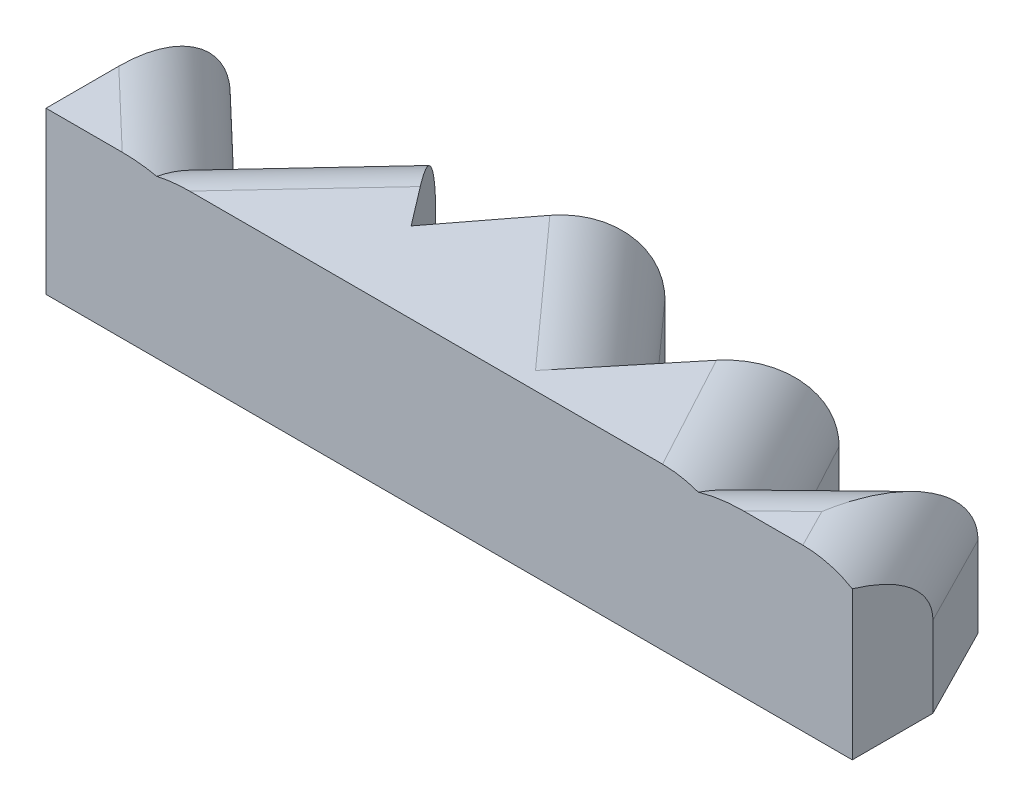
ISO-10303-21;
HEADER;
FILE_DESCRIPTION(('STEP AP214'),'2;1');
FILE_NAME('part.step','',(''),(''),'','','');
FILE_SCHEMA(('AUTOMOTIVE_DESIGN { 1 0 10303 214 1 1 1 1 }'));
ENDSEC;
DATA;
#1=APPLICATION_CONTEXT('core data for automotive mechanical design processes');
#2=APPLICATION_PROTOCOL_DEFINITION('international standard','automotive_design',2000,#1);
#3=PRODUCT_CONTEXT('',#1,'mechanical');
#4=PRODUCT('Part','Part','',(#3));
#5=PRODUCT_RELATED_PRODUCT_CATEGORY('part','',(#4));
#6=PRODUCT_DEFINITION_FORMATION('','',#4);
#7=PRODUCT_DEFINITION_CONTEXT('part definition',#1,'design');
#8=PRODUCT_DEFINITION('design','',#6,#7);
#9=PRODUCT_DEFINITION_SHAPE('','',#8);
#10=(LENGTH_UNIT() NAMED_UNIT(*) SI_UNIT(.MILLI.,.METRE.));
#11=(NAMED_UNIT(*) PLANE_ANGLE_UNIT() SI_UNIT($,.RADIAN.));
#12=(NAMED_UNIT(*) SI_UNIT($,.STERADIAN.) SOLID_ANGLE_UNIT());
#13=UNCERTAINTY_MEASURE_WITH_UNIT(LENGTH_MEASURE(1.E-05),#10,'distance_accuracy_value','');
#14=(GEOMETRIC_REPRESENTATION_CONTEXT(3) GLOBAL_UNCERTAINTY_ASSIGNED_CONTEXT((#13)) GLOBAL_UNIT_ASSIGNED_CONTEXT((#10,
#11,#12)) REPRESENTATION_CONTEXT('',''));
#15=CARTESIAN_POINT('',(0.,0.,0.));
#16=DIRECTION('',(0.,0.,1.));
#17=DIRECTION('',(1.,0.,0.));
#18=AXIS2_PLACEMENT_3D('',#15,#16,#17);
#19=CARTESIAN_POINT('',(0.,129.522150417628,0.));
#20=DIRECTION('',(0.,-1.,0.));
#21=DIRECTION('',(0.,0.,-1.));
#22=AXIS2_PLACEMENT_3D('',#19,#20,#21);
#23=PLANE('',#22);
#24=DIRECTION('',(1.,0.,0.));
#25=VECTOR('',#24,1.);
#26=CARTESIAN_POINT('',(-32.3481367773547,129.522150417628,19.2762862056775));
#27=LINE('',#26,#25);
#28=CARTESIAN_POINT('',(-32.3481367773547,129.522150417628,19.2762862056775));
#29=VERTEX_POINT('',#28);
#30=CARTESIAN_POINT('',(-20.343396887675,129.522150417628,19.2762862056775));
#31=VERTEX_POINT('',#30);
#32=EDGE_CURVE('E241',#29,#31,#27,.T.);
#33=ORIENTED_EDGE('',*,*,#32,.T.);
#34=DIRECTION('',(-0.72314339482571,0.,-0.690697930009891));
#35=VECTOR('',#34,1.);
#36=CARTESIAN_POINT('',(-41.1200004884803,129.522150417628,-0.568128059035559));
#37=LINE('',#36,#35);
#38=CARTESIAN_POINT('',(-32.3481367773547,129.522150417628,7.81016613676997));
#39=VERTEX_POINT('',#38);
#40=EDGE_CURVE('E268',#31,#39,#37,.T.);
#41=ORIENTED_EDGE('',*,*,#40,.T.);
#42=DIRECTION('',(0.,0.,1.));
#43=VECTOR('',#42,1.);
#44=CARTESIAN_POINT('',(-32.3481367773547,129.522150417628,19.2762862056775));
#45=LINE('',#44,#43);
#46=EDGE_CURVE('E186',#39,#29,#45,.T.);
#47=ORIENTED_EDGE('',*,*,#46,.T.);
#48=EDGE_LOOP('',(#33,#41,#47));
#49=FACE_BOUND('',#48,.T.);
#50=ADVANCED_FACE('F35',(#49),#23,.F.);
#51=CARTESIAN_POINT('',(77.4999391454989,129.522150417628,19.2762862056775));
#52=VERTEX_POINT('',#51);
#53=CARTESIAN_POINT('',(86.8691931880467,129.522150417628,19.2762862056775));
#54=VERTEX_POINT('',#53);
#55=EDGE_CURVE('E245',#52,#54,#27,.T.);
#56=ORIENTED_EDGE('',*,*,#55,.T.);
#57=DIRECTION('',(-0.453980296267082,0.,-0.891011723043672));
#58=VECTOR('',#57,1.);
#59=CARTESIAN_POINT('',(75.9571059131953,129.522150417628,-2.14049722020102));
#60=LINE('',#59,#58);
#61=CARTESIAN_POINT('',(83.7691723837131,129.522150417628,13.1919805627834));
#62=VERTEX_POINT('',#61);
#63=EDGE_CURVE('E263',#54,#62,#60,.T.);
#64=ORIENTED_EDGE('',*,*,#63,.T.);
#65=DIRECTION('',(-0.717611490333165,0.,0.696443643765821));
#66=VECTOR('',#65,1.);
#67=CARTESIAN_POINT('',(81.1952769690681,129.522150417628,15.6899521329086));
#68=LINE('',#67,#66);
#69=EDGE_CURVE('E261',#62,#52,#68,.T.);
#70=ORIENTED_EDGE('',*,*,#69,.T.);
#71=EDGE_LOOP('',(#56,#64,#70));
#72=FACE_BOUND('',#71,.T.);
#73=ADVANCED_FACE('F333',(#72),#23,.F.);
#74=CARTESIAN_POINT('',(-32.3481367773547,104.122150417628,247.876286205677));
#75=DIRECTION('',(0.,-1.,0.));
#76=DIRECTION('',(0.,0.,-1.));
#77=AXIS2_PLACEMENT_3D('',#74,#75,#76);
#78=PLANE('',#77);
#79=DIRECTION('',(1.,0.,0.));
#80=VECTOR('',#79,1.);
#81=CARTESIAN_POINT('',(-32.3481367773547,104.122150417628,19.2762862056775));
#82=LINE('',#81,#80);
#83=CARTESIAN_POINT('',(-32.3481367773547,104.122150417628,19.2762862056775));
#84=VERTEX_POINT('',#83);
#85=CARTESIAN_POINT('',(94.6518632226453,104.122150417628,19.2762862056775));
#86=VERTEX_POINT('',#85);
#87=EDGE_CURVE('E172',#84,#86,#82,.T.);
#88=ORIENTED_EDGE('',*,*,#87,.F.);
#89=DIRECTION('',(0.,0.,1.));
#90=VECTOR('',#89,1.);
#91=CARTESIAN_POINT('',(-32.3481367773547,104.122150417628,19.2762862056775));
#92=LINE('',#91,#90);
#93=CARTESIAN_POINT('',(-32.3481367773547,104.122150417628,-9.75204917332207));
#94=VERTEX_POINT('',#93);
#95=EDGE_CURVE('E165',#94,#84,#92,.T.);
#96=ORIENTED_EDGE('',*,*,#95,.F.);
#97=DIRECTION('',(-0.72314339482571,0.,-0.690697930009891));
#98=VECTOR('',#97,1.);
#99=CARTESIAN_POINT('',(-32.3481367773547,104.122150417628,-9.75204917332206));
#100=LINE('',#99,#98);
#101=CARTESIAN_POINT('',(-15.2527795093036,104.122150417628,6.57628620567745));
#102=VERTEX_POINT('',#101);
#103=EDGE_CURVE('E169',#102,#94,#100,.T.);
#104=ORIENTED_EDGE('',*,*,#103,.F.);
#105=DIRECTION('',(-0.682629126541357,0.,0.730764993412646));
#106=VECTOR('',#105,1.);
#107=CARTESIAN_POINT('',(-15.2527795093036,104.122150417628,6.57628620567745));
#108=LINE('',#107,#106);
#109=CARTESIAN_POINT('',(0.,104.122150417628,-9.75204917332206));
#110=VERTEX_POINT('',#109);
#111=EDGE_CURVE('E193',#110,#102,#108,.T.);
#112=ORIENTED_EDGE('',*,*,#111,.F.);
#113=DIRECTION('',(-0.60686514151149,0.,-0.794804818819211));
#114=VECTOR('',#113,1.);
#115=CARTESIAN_POINT('',(0.,104.122150417628,-9.75204917332206));
#116=LINE('',#115,#114);
#117=CARTESIAN_POINT('',(12.4673345276705,104.122150417628,6.57628620567745));
#118=VERTEX_POINT('',#117);
#119=EDGE_CURVE('E201',#118,#110,#116,.T.);
#120=ORIENTED_EDGE('',*,*,#119,.F.);
#121=DIRECTION('',(-0.607933072564417,0.,0.793988274020711));
#122=VECTOR('',#121,1.);
#123=CARTESIAN_POINT('',(12.4673345276705,104.122150417628,6.57628620567745));
#124=LINE('',#123,#122);
#125=CARTESIAN_POINT('',(29.7989689384721,104.122150417628,-16.0596175028385));
#126=VERTEX_POINT('',#125);
#127=EDGE_CURVE('E205',#126,#118,#124,.T.);
#128=ORIENTED_EDGE('',*,*,#127,.F.);
#129=DIRECTION('',(-0.668321606968674,0.,-0.743872455235983));
#130=VECTOR('',#129,1.);
#131=CARTESIAN_POINT('',(29.7989689384721,104.122150417628,-16.0596175028385));
#132=LINE('',#131,#130);
#133=CARTESIAN_POINT('',(50.1358740559823,104.122150417628,6.57628620567745));
#134=VERTEX_POINT('',#133);
#135=EDGE_CURVE('E209',#134,#126,#132,.T.);
#136=ORIENTED_EDGE('',*,*,#135,.F.);
#137=DIRECTION('',(-0.634694505570327,0.,0.772763149094752));
#138=VECTOR('',#137,1.);
#139=CARTESIAN_POINT('',(50.1358740559823,104.122150417628,6.57628620567745));
#140=LINE('',#139,#138);
#141=CARTESIAN_POINT('',(63.5468457907251,104.122150417628,-9.75204917332206));
#142=VERTEX_POINT('',#141);
#143=EDGE_CURVE('E213',#142,#134,#140,.T.);
#144=ORIENTED_EDGE('',*,*,#143,.F.);
#145=DIRECTION('',(-0.474576845842874,0.,-0.88021407475104));
#146=VECTOR('',#145,1.);
#147=CARTESIAN_POINT('',(63.5468457907251,104.122150417628,-9.75204917332206));
#148=LINE('',#147,#146);
#149=CARTESIAN_POINT('',(72.3504426932422,104.122150417628,6.57628620567745));
#150=VERTEX_POINT('',#149);
#151=EDGE_CURVE('E217',#150,#142,#148,.T.);
#152=ORIENTED_EDGE('',*,*,#151,.F.);
#153=DIRECTION('',(-0.717611490333165,0.,0.696443643765821));
#154=VECTOR('',#153,1.);
#155=CARTESIAN_POINT('',(72.3504426932422,104.122150417628,6.57628620567745));
#156=LINE('',#155,#154);
#157=CARTESIAN_POINT('',(87.27295479585,104.122150417628,-7.90604698279296));
#158=VERTEX_POINT('',#157);
#159=EDGE_CURVE('E221',#158,#150,#156,.T.);
#160=ORIENTED_EDGE('',*,*,#159,.F.);
#161=DIRECTION('',(-0.453980296267082,0.,-0.891011723043672));
#162=VECTOR('',#161,1.);
#163=CARTESIAN_POINT('',(87.27295479585,104.122150417628,-7.90604698279296));
#164=LINE('',#163,#162);
#165=CARTESIAN_POINT('',(94.6518632226453,104.122150417628,6.57628620567745));
#166=VERTEX_POINT('',#165);
#167=EDGE_CURVE('E225',#166,#158,#164,.T.);
#168=ORIENTED_EDGE('',*,*,#167,.F.);
#169=DIRECTION('',(0.,0.,-1.));
#170=VECTOR('',#169,1.);
#171=CARTESIAN_POINT('',(94.6518632226453,104.122150417628,19.2762862056775));
#172=LINE('',#171,#170);
#173=EDGE_CURVE('E249',#86,#166,#172,.T.);
#174=ORIENTED_EDGE('',*,*,#173,.F.);
#175=EDGE_LOOP('',(#88,#96,#104,#112,#120,#128,#136,#144,#152,#160,#168,#174));
#176=FACE_BOUND('',#175,.T.);
#177=ADVANCED_FACE('F167',(#176),#78,.T.);
#178=DIRECTION('',(-0.60686514151149,0.,-0.794804818819211));
#179=VECTOR('',#178,1.);
#180=CARTESIAN_POINT('',(0.,129.522150417628,-9.75204917332206));
#181=LINE('',#180,#179);
#182=CARTESIAN_POINT('',(12.4673345276705,129.522150417628,6.57628620567745));
#183=VERTEX_POINT('',#182);
#184=CARTESIAN_POINT('',(7.81636059118034,129.522150417628,0.484955127214266));
#185=VERTEX_POINT('',#184);
#186=EDGE_CURVE('E227',#183,#185,#181,.T.);
#187=ORIENTED_EDGE('',*,*,#186,.T.);
#188=DIRECTION('',(-0.682629126541357,0.,0.730764993412646));
#189=VECTOR('',#188,1.);
#190=CARTESIAN_POINT('',(-5.97206409296299,129.522150417628,15.2456761127527));
#191=LINE('',#190,#189);
#192=CARTESIAN_POINT('',(-9.73717582103445,129.522150417628,19.2762862056775));
#193=VERTEX_POINT('',#192);
#194=EDGE_CURVE('E266',#185,#193,#191,.T.);
#195=ORIENTED_EDGE('',*,*,#194,.T.);
#196=CARTESIAN_POINT('',(64.7694754612846,129.522150417628,19.2762862056775));
#197=VERTEX_POINT('',#196);
#198=EDGE_CURVE('E244',#193,#197,#27,.T.);
#199=ORIENTED_EDGE('',*,*,#198,.T.);
#200=DIRECTION('',(-0.474576845842874,0.,-0.88021407475104));
#201=VECTOR('',#200,1.);
#202=CARTESIAN_POINT('',(52.3681270413869,129.522150417628,-3.72492323111756));
#203=LINE('',#202,#201);
#204=CARTESIAN_POINT('',(54.8364522947318,129.522150417628,0.853164908009541));
#205=VERTEX_POINT('',#204);
#206=EDGE_CURVE('E259',#197,#205,#203,.T.);
#207=ORIENTED_EDGE('',*,*,#206,.T.);
#208=DIRECTION('',(-0.634694505570327,0.,0.772763149094752));
#209=VECTOR('',#208,1.);
#210=CARTESIAN_POINT('',(50.1358740559823,129.522150417628,6.57628620567745));
#211=LINE('',#210,#209);
#212=CARTESIAN_POINT('',(41.9821882343375,129.522150417628,16.5036888804518));
#213=VERTEX_POINT('',#212);
#214=EDGE_CURVE('E197',#205,#213,#211,.T.);
#215=ORIENTED_EDGE('',*,*,#214,.T.);
#216=DIRECTION('',(-0.668321606968674,0.,-0.743872455235983));
#217=VECTOR('',#216,1.);
#218=CARTESIAN_POINT('',(20.3517887569751,129.522150417628,-7.57193309433631));
#219=LINE('',#218,#217);
#220=CARTESIAN_POINT('',(21.9436109678654,129.522150417628,-5.80016231217517));
#221=VERTEX_POINT('',#220);
#222=EDGE_CURVE('E256',#213,#221,#219,.T.);
#223=ORIENTED_EDGE('',*,*,#222,.T.);
#224=DIRECTION('',(-0.607933072564417,0.,0.793988274020711));
#225=VECTOR('',#224,1.);
#226=CARTESIAN_POINT('',(12.4673345276705,129.522150417628,6.57628620567745));
#227=LINE('',#226,#225);
#228=EDGE_CURVE('E355',#221,#183,#227,.T.);
#229=ORIENTED_EDGE('',*,*,#228,.T.);
#230=EDGE_LOOP('',(#187,#195,#199,#207,#215,#223,#229));
#231=FACE_BOUND('',#230,.T.);
#232=ADVANCED_FACE('F328',(#231),#23,.F.);
#233=CARTESIAN_POINT('',(-32.3481367773547,-23.5112699706078,19.2762862056775));
#234=DIRECTION('',(0.,0.,1.));
#235=DIRECTION('',(1.,0.,0.));
#236=AXIS2_PLACEMENT_3D('',#233,#234,#235);
#237=PLANE('',#236);
#238=CARTESIAN_POINT('',(-9.73717582103445,116.822150417628,19.2762862056775));
#239=DIRECTION('',(0.,0.,1.));
#240=DIRECTION('',(1.,0.,0.));
#241=AXIS2_PLACEMENT_3D('',#238,#239,#240);
#242=ELLIPSE('',#241,17.3790481406224,12.7);
#243=CARTESIAN_POINT('',(-14.8908065033722,128.95089908893,19.2762862056775));
#244=VERTEX_POINT('',#243);
#245=EDGE_CURVE('E280',#193,#244,#242,.T.);
#246=ORIENTED_EDGE('',*,*,#245,.T.);
#247=CARTESIAN_POINT('',(-20.343396887675,116.822150417628,19.2762862056775));
#248=DIRECTION('',(0.,0.,1.));
#249=DIRECTION('',(1.,0.,0.));
#250=AXIS2_PLACEMENT_3D('',#247,#248,#249);
#251=ELLIPSE('',#250,18.3871985830595,12.7);
#252=EDGE_CURVE('E282',#244,#31,#251,.T.);
#253=ORIENTED_EDGE('',*,*,#252,.T.);
#254=ORIENTED_EDGE('',*,*,#32,.F.);
#255=DIRECTION('',(0.,1.,0.));
#256=VECTOR('',#255,1.);
#257=CARTESIAN_POINT('',(-32.3481367773547,-23.5112699706078,19.2762862056775));
#258=LINE('',#257,#256);
#259=EDGE_CURVE('E176',#84,#29,#258,.T.);
#260=ORIENTED_EDGE('',*,*,#259,.F.);
#261=ORIENTED_EDGE('',*,*,#87,.T.);
#262=DIRECTION('',(0.,1.,0.));
#263=VECTOR('',#262,1.);
#264=CARTESIAN_POINT('',(94.6518632226453,-23.5112699706078,19.2762862056775));
#265=LINE('',#264,#263);
#266=CARTESIAN_POINT('',(94.6518632226453,127.461859055786,19.2762862056775));
#267=VERTEX_POINT('',#266);
#268=EDGE_CURVE('E247',#86,#267,#265,.T.);
#269=ORIENTED_EDGE('',*,*,#268,.T.);
#270=CARTESIAN_POINT('',(86.8691931880467,116.822150417628,19.2762862056774));
#271=DIRECTION('',(0.,0.,1.));
#272=DIRECTION('',(1.,0.,0.));
#273=AXIS2_PLACEMENT_3D('',#270,#271,#272);
#274=ELLIPSE('',#273,14.2534600517007,12.7);
#275=EDGE_CURVE('E278',#267,#54,#274,.T.);
#276=ORIENTED_EDGE('',*,*,#275,.T.);
#277=ORIENTED_EDGE('',*,*,#55,.F.);
#278=CARTESIAN_POINT('',(77.4999391454989,116.822150417628,19.2762862056775));
#279=DIRECTION('',(0.,0.,1.));
#280=DIRECTION('',(1.,0.,0.));
#281=AXIS2_PLACEMENT_3D('',#278,#279,#280);
#282=ELLIPSE('',#281,18.2355027771211,12.7);
#283=CARTESIAN_POINT('',(70.3927952287499,128.517885554147,19.2762862056774));
#284=VERTEX_POINT('',#283);
#285=EDGE_CURVE('E276',#52,#284,#282,.T.);
#286=ORIENTED_EDGE('',*,*,#285,.T.);
#287=CARTESIAN_POINT('',(64.7694754612846,116.822150417628,19.2762862056774));
#288=DIRECTION('',(0.,0.,1.));
#289=DIRECTION('',(1.,0.,0.));
#290=AXIS2_PLACEMENT_3D('',#287,#288,#289);
#291=ELLIPSE('',#290,14.4283082539802,12.7);
#292=EDGE_CURVE('E274',#284,#197,#291,.T.);
#293=ORIENTED_EDGE('',*,*,#292,.T.);
#294=ORIENTED_EDGE('',*,*,#198,.F.);
#295=EDGE_LOOP('',(#246,#253,#254,#260,#261,#269,#276,#277,#286,#293,#294));
#296=FACE_BOUND('',#295,.T.);
#297=ADVANCED_FACE('F323',(#296),#237,.T.);
#298=CARTESIAN_POINT('',(94.6518632226453,-23.5112699706078,19.2762862056775));
#299=DIRECTION('',(1.,0.,0.));
#300=DIRECTION('',(0.,0.,-1.));
#301=AXIS2_PLACEMENT_3D('',#298,#299,#300);
#302=PLANE('',#301);
#303=DIRECTION('',(0.,1.,0.));
#304=VECTOR('',#303,1.);
#305=CARTESIAN_POINT('',(94.6518632226453,-23.5112699706078,6.57628620567745));
#306=LINE('',#305,#304);
#307=CARTESIAN_POINT('',(94.6518632226453,116.822150417628,6.57628620567745));
#308=VERTEX_POINT('',#307);
#309=EDGE_CURVE('E177',#166,#308,#306,.T.);
#310=ORIENTED_EDGE('',*,*,#309,.T.);
#311=CARTESIAN_POINT('',(94.6518632226453,116.822150417628,34.551068601362));
#312=DIRECTION('',(1.,0.,0.));
#313=DIRECTION('',(0.,0.,1.));
#314=AXIS2_PLACEMENT_3D('',#311,#312,#313);
#315=ELLIPSE('',#314,27.9747823956845,12.7);
#316=EDGE_CURVE('E290',#308,#267,#315,.T.);
#317=ORIENTED_EDGE('',*,*,#316,.T.);
#318=ORIENTED_EDGE('',*,*,#268,.F.);
#319=ORIENTED_EDGE('',*,*,#173,.T.);
#320=EDGE_LOOP('',(#310,#317,#318,#319));
#321=FACE_BOUND('',#320,.T.);
#322=ADVANCED_FACE('F339',(#321),#302,.T.);
#323=CARTESIAN_POINT('',(-32.3481367773547,-23.5112699706078,19.2762862056775));
#324=DIRECTION('',(-1.,0.,0.));
#325=DIRECTION('',(0.,0.,1.));
#326=AXIS2_PLACEMENT_3D('',#323,#324,#325);
#327=PLANE('',#326);
#328=ORIENTED_EDGE('',*,*,#46,.F.);
#329=CARTESIAN_POINT('',(-32.3481367773547,116.822150417628,7.81016613676997));
#330=DIRECTION('',(-1.,0.,0.));
#331=DIRECTION('',(0.,0.,1.));
#332=AXIS2_PLACEMENT_3D('',#329,#330,#331);
#333=ELLIPSE('',#332,17.562215310092,12.7);
#334=CARTESIAN_POINT('',(-32.3481367773547,116.822150417628,-9.75204917332206));
#335=VERTEX_POINT('',#334);
#336=EDGE_CURVE('E183',#39,#335,#333,.T.);
#337=ORIENTED_EDGE('',*,*,#336,.T.);
#338=DIRECTION('',(0.,1.,0.));
#339=VECTOR('',#338,1.);
#340=CARTESIAN_POINT('',(-32.3481367773547,-25.6246471225126,-9.75204917332206));
#341=LINE('',#340,#339);
#342=EDGE_CURVE('E180',#94,#335,#341,.T.);
#343=ORIENTED_EDGE('',*,*,#342,.F.);
#344=ORIENTED_EDGE('',*,*,#95,.T.);
#345=ORIENTED_EDGE('',*,*,#259,.T.);
#346=EDGE_LOOP('',(#328,#337,#343,#344,#345));
#347=FACE_BOUND('',#346,.T.);
#348=ADVANCED_FACE('F182',(#347),#327,.T.);
#349=CARTESIAN_POINT('',(87.27295479585,-25.6246471225126,-7.90604698279296));
#350=DIRECTION('',(0.891011723043672,0.,-0.453980296267081));
#351=DIRECTION('',(-0.453980296267082,0.,-0.891011723043672));
#352=AXIS2_PLACEMENT_3D('',#349,#350,#351);
#353=PLANE('',#352);
#354=DIRECTION('',(0.,1.,0.));
#355=VECTOR('',#354,1.);
#356=CARTESIAN_POINT('',(87.27295479585,-25.6246471225126,-7.90604698279296));
#357=LINE('',#356,#355);
#358=CARTESIAN_POINT('',(87.27295479585,116.822150417628,-7.90604698279296));
#359=VERTEX_POINT('',#358);
#360=EDGE_CURVE('E224',#158,#359,#357,.T.);
#361=ORIENTED_EDGE('',*,*,#360,.T.);
#362=DIRECTION('',(-0.453980296267082,0.,-0.891011723043672));
#363=VECTOR('',#362,1.);
#364=CARTESIAN_POINT('',(94.6518632226453,116.822150417628,6.57628620567746));
#365=LINE('',#364,#363);
#366=EDGE_CURVE('E288',#359,#308,#365,.F.);
#367=ORIENTED_EDGE('',*,*,#366,.T.);
#368=ORIENTED_EDGE('',*,*,#309,.F.);
#369=ORIENTED_EDGE('',*,*,#167,.T.);
#370=EDGE_LOOP('',(#361,#367,#368,#369));
#371=FACE_BOUND('',#370,.T.);
#372=ADVANCED_FACE('F343',(#371),#353,.T.);
#373=CARTESIAN_POINT('',(72.3504426932422,-25.6246471225126,6.57628620567745));
#374=DIRECTION('',(-0.696443643765821,0.,-0.717611490333165));
#375=DIRECTION('',(-0.717611490333165,0.,0.696443643765821));
#376=AXIS2_PLACEMENT_3D('',#373,#374,#375);
#377=PLANE('',#376);
#378=DIRECTION('',(0.,1.,0.));
#379=VECTOR('',#378,1.);
#380=CARTESIAN_POINT('',(72.3504426932422,-25.6246471225126,6.57628620567745));
#381=LINE('',#380,#379);
#382=CARTESIAN_POINT('',(72.3504426932422,116.822150417628,6.57628620567745));
#383=VERTEX_POINT('',#382);
#384=EDGE_CURVE('E220',#150,#383,#381,.T.);
#385=ORIENTED_EDGE('',*,*,#384,.T.);
#386=DIRECTION('',(-0.717611490333165,0.,0.696443643765821));
#387=VECTOR('',#386,1.);
#388=CARTESIAN_POINT('',(87.27295479585,116.822150417628,-7.90604698279295));
#389=LINE('',#388,#387);
#390=EDGE_CURVE('E292',#383,#359,#389,.F.);
#391=ORIENTED_EDGE('',*,*,#390,.T.);
#392=ORIENTED_EDGE('',*,*,#360,.F.);
#393=ORIENTED_EDGE('',*,*,#159,.T.);
#394=EDGE_LOOP('',(#385,#391,#392,#393));
#395=FACE_BOUND('',#394,.T.);
#396=ADVANCED_FACE('F346',(#395),#377,.T.);
#397=CARTESIAN_POINT('',(63.5468457907251,-25.6246471225126,-9.75204917332206));
#398=DIRECTION('',(0.88021407475104,0.,-0.474576845842874));
#399=DIRECTION('',(-0.474576845842874,0.,-0.88021407475104));
#400=AXIS2_PLACEMENT_3D('',#397,#398,#399);
#401=PLANE('',#400);
#402=DIRECTION('',(0.,1.,0.));
#403=VECTOR('',#402,1.);
#404=CARTESIAN_POINT('',(63.5468457907251,-25.6246471225126,-9.75204917332206));
#405=LINE('',#404,#403);
#406=CARTESIAN_POINT('',(63.5468457907251,116.822150417628,-9.75204917332206));
#407=VERTEX_POINT('',#406);
#408=EDGE_CURVE('E216',#142,#407,#405,.T.);
#409=ORIENTED_EDGE('',*,*,#408,.T.);
#410=DIRECTION('',(-0.474576845842874,0.,-0.88021407475104));
#411=VECTOR('',#410,1.);
#412=CARTESIAN_POINT('',(72.3504426932422,116.822150417628,6.57628620567746));
#413=LINE('',#412,#411);
#414=EDGE_CURVE('E296',#407,#383,#413,.F.);
#415=ORIENTED_EDGE('',*,*,#414,.T.);
#416=ORIENTED_EDGE('',*,*,#384,.F.);
#417=ORIENTED_EDGE('',*,*,#151,.T.);
#418=EDGE_LOOP('',(#409,#415,#416,#417));
#419=FACE_BOUND('',#418,.T.);
#420=ADVANCED_FACE('F349',(#419),#401,.T.);
#421=CARTESIAN_POINT('',(50.1358740559823,-25.6246471225126,6.57628620567745));
#422=DIRECTION('',(-0.772763149094752,0.,-0.634694505570327));
#423=DIRECTION('',(-0.634694505570327,0.,0.772763149094752));
#424=AXIS2_PLACEMENT_3D('',#421,#422,#423);
#425=PLANE('',#424);
#426=ORIENTED_EDGE('',*,*,#214,.F.);
#427=CARTESIAN_POINT('',(54.8364522947318,116.822150417628,0.853164908009539));
#428=DIRECTION('',(-0.772763149094752,0.,-0.634694505570327));
#429=DIRECTION('',(-0.634694505570327,0.,0.772763149094752));
#430=AXIS2_PLACEMENT_3D('',#427,#428,#429);
#431=ELLIPSE('',#430,13.7237575235763,12.7);
#432=EDGE_CURVE('E294',#205,#407,#431,.T.);
#433=ORIENTED_EDGE('',*,*,#432,.T.);
#434=ORIENTED_EDGE('',*,*,#408,.F.);
#435=ORIENTED_EDGE('',*,*,#143,.T.);
#436=DIRECTION('',(0.,1.,0.));
#437=VECTOR('',#436,1.);
#438=CARTESIAN_POINT('',(50.1358740559823,-25.6246471225126,6.57628620567745));
#439=LINE('',#438,#437);
#440=CARTESIAN_POINT('',(50.1358740559823,116.822150417628,6.57628620567745));
#441=VERTEX_POINT('',#440);
#442=EDGE_CURVE('E212',#134,#441,#439,.T.);
#443=ORIENTED_EDGE('',*,*,#442,.T.);
#444=CARTESIAN_POINT('',(41.9821882343376,116.822150417628,16.5036888804518));
#445=DIRECTION('',(-0.772763149094752,0.,-0.634694505570327));
#446=DIRECTION('',(-0.634694505570327,0.,0.772763149094752));
#447=AXIS2_PLACEMENT_3D('',#444,#445,#446);
#448=ELLIPSE('',#447,12.8466305444349,12.7);
#449=EDGE_CURVE('E11',#441,#213,#448,.F.);
#450=ORIENTED_EDGE('',*,*,#449,.T.);
#451=EDGE_LOOP('',(#426,#433,#434,#435,#443,#450));
#452=FACE_BOUND('',#451,.T.);
#453=ADVANCED_FACE('F352',(#452),#425,.T.);
#454=CARTESIAN_POINT('',(29.7989689384721,-25.6246471225126,-16.0596175028385));
#455=DIRECTION('',(0.743872455235983,0.,-0.668321606968674));
#456=DIRECTION('',(-0.668321606968674,0.,-0.743872455235983));
#457=AXIS2_PLACEMENT_3D('',#454,#455,#456);
#458=PLANE('',#457);
#459=DIRECTION('',(0.,1.,0.));
#460=VECTOR('',#459,1.);
#461=CARTESIAN_POINT('',(29.7989689384721,-25.6246471225126,-16.0596175028385));
#462=LINE('',#461,#460);
#463=CARTESIAN_POINT('',(29.7989689384721,116.822150417628,-16.0596175028385));
#464=VERTEX_POINT('',#463);
#465=EDGE_CURVE('E208',#126,#464,#462,.T.);
#466=ORIENTED_EDGE('',*,*,#465,.T.);
#467=DIRECTION('',(-0.668321606968674,0.,-0.743872455235983));
#468=VECTOR('',#467,1.);
#469=CARTESIAN_POINT('',(50.1358740559823,116.822150417628,6.57628620567746));
#470=LINE('',#469,#468);
#471=EDGE_CURVE('E44',#464,#441,#470,.F.);
#472=ORIENTED_EDGE('',*,*,#471,.T.);
#473=ORIENTED_EDGE('',*,*,#442,.F.);
#474=ORIENTED_EDGE('',*,*,#135,.T.);
#475=EDGE_LOOP('',(#466,#472,#473,#474));
#476=FACE_BOUND('',#475,.T.);
#477=ADVANCED_FACE('F376',(#476),#458,.T.);
#478=CARTESIAN_POINT('',(12.4673345276705,-25.6246471225126,6.57628620567745));
#479=DIRECTION('',(-0.793988274020711,0.,-0.607933072564417));
#480=DIRECTION('',(-0.607933072564417,0.,0.793988274020711));
#481=AXIS2_PLACEMENT_3D('',#478,#479,#480);
#482=PLANE('',#481);
#483=ORIENTED_EDGE('',*,*,#228,.F.);
#484=CARTESIAN_POINT('',(21.9436109678654,116.822150417628,-5.80016231217517));
#485=DIRECTION('',(-0.793988274020711,0.,-0.607933072564417));
#486=DIRECTION('',(-0.607933072564417,0.,0.793988274020711));
#487=AXIS2_PLACEMENT_3D('',#484,#485,#486);
#488=ELLIPSE('',#487,12.9214190263919,12.7);
#489=EDGE_CURVE('E52',#221,#464,#488,.T.);
#490=ORIENTED_EDGE('',*,*,#489,.T.);
#491=ORIENTED_EDGE('',*,*,#465,.F.);
#492=ORIENTED_EDGE('',*,*,#127,.T.);
#493=DIRECTION('',(0.,1.,0.));
#494=VECTOR('',#493,1.);
#495=CARTESIAN_POINT('',(12.4673345276705,-25.6246471225126,6.57628620567745));
#496=LINE('',#495,#494);
#497=EDGE_CURVE('E204',#118,#183,#496,.T.);
#498=ORIENTED_EDGE('',*,*,#497,.T.);
#499=EDGE_LOOP('',(#483,#490,#491,#492,#498));
#500=FACE_BOUND('',#499,.T.);
#501=ADVANCED_FACE('F375',(#500),#482,.T.);
#502=CARTESIAN_POINT('',(0.,-25.6246471225126,-9.75204917332206));
#503=DIRECTION('',(0.794804818819211,0.,-0.60686514151149));
#504=DIRECTION('',(-0.60686514151149,0.,-0.794804818819211));
#505=AXIS2_PLACEMENT_3D('',#502,#503,#504);
#506=PLANE('',#505);
#507=DIRECTION('',(0.,1.,0.));
#508=VECTOR('',#507,1.);
#509=CARTESIAN_POINT('',(0.,-25.6246471225126,-9.75204917332206));
#510=LINE('',#509,#508);
#511=CARTESIAN_POINT('',(0.,116.822150417628,-9.75204917332206));
#512=VERTEX_POINT('',#511);
#513=EDGE_CURVE('E200',#110,#512,#510,.T.);
#514=ORIENTED_EDGE('',*,*,#513,.T.);
#515=CARTESIAN_POINT('',(7.81636059118035,116.822150417628,0.484955127214269));
#516=DIRECTION('',(0.794804818819211,0.,-0.60686514151149));
#517=DIRECTION('',(-0.60686514151149,0.,-0.794804818819211));
#518=AXIS2_PLACEMENT_3D('',#515,#516,#517);
#519=ELLIPSE('',#518,12.8798971246108,12.7);
#520=EDGE_CURVE('E286',#512,#185,#519,.T.);
#521=ORIENTED_EDGE('',*,*,#520,.T.);
#522=ORIENTED_EDGE('',*,*,#186,.F.);
#523=ORIENTED_EDGE('',*,*,#497,.F.);
#524=ORIENTED_EDGE('',*,*,#119,.T.);
#525=EDGE_LOOP('',(#514,#521,#522,#523,#524));
#526=FACE_BOUND('',#525,.T.);
#527=ADVANCED_FACE('F374',(#526),#506,.T.);
#528=CARTESIAN_POINT('',(-15.2527795093036,-25.6246471225126,6.57628620567745));
#529=DIRECTION('',(-0.730764993412646,0.,-0.682629126541357));
#530=DIRECTION('',(-0.682629126541357,0.,0.730764993412646));
#531=AXIS2_PLACEMENT_3D('',#528,#529,#530);
#532=PLANE('',#531);
#533=DIRECTION('',(0.,1.,0.));
#534=VECTOR('',#533,1.);
#535=CARTESIAN_POINT('',(-15.2527795093036,-25.6246471225126,6.57628620567745));
#536=LINE('',#535,#534);
#537=CARTESIAN_POINT('',(-15.2527795093036,116.822150417628,6.57628620567745));
#538=VERTEX_POINT('',#537);
#539=EDGE_CURVE('E190',#102,#538,#536,.T.);
#540=ORIENTED_EDGE('',*,*,#539,.T.);
#541=DIRECTION('',(-0.682629126541357,0.,0.730764993412646));
#542=VECTOR('',#541,1.);
#543=CARTESIAN_POINT('',(0.,116.822150417628,-9.75204917332206));
#544=LINE('',#543,#542);
#545=EDGE_CURVE('E284',#538,#512,#544,.F.);
#546=ORIENTED_EDGE('',*,*,#545,.T.);
#547=ORIENTED_EDGE('',*,*,#513,.F.);
#548=ORIENTED_EDGE('',*,*,#111,.T.);
#549=EDGE_LOOP('',(#540,#546,#547,#548));
#550=FACE_BOUND('',#549,.T.);
#551=ADVANCED_FACE('F372',(#550),#532,.T.);
#552=CARTESIAN_POINT('',(-32.3481367773547,-25.6246471225126,-9.75204917332206));
#553=DIRECTION('',(0.690697930009891,0.,-0.723143394825709));
#554=DIRECTION('',(-0.72314339482571,0.,-0.690697930009891));
#555=AXIS2_PLACEMENT_3D('',#552,#553,#554);
#556=PLANE('',#555);
#557=ORIENTED_EDGE('',*,*,#342,.T.);
#558=DIRECTION('',(-0.72314339482571,0.,-0.690697930009891));
#559=VECTOR('',#558,1.);
#560=CARTESIAN_POINT('',(-15.2527795093036,116.822150417628,6.57628620567745));
#561=LINE('',#560,#559);
#562=EDGE_CURVE('E272',#335,#538,#561,.F.);
#563=ORIENTED_EDGE('',*,*,#562,.T.);
#564=ORIENTED_EDGE('',*,*,#539,.F.);
#565=ORIENTED_EDGE('',*,*,#103,.T.);
#566=EDGE_LOOP('',(#557,#563,#564,#565));
#567=FACE_BOUND('',#566,.T.);
#568=ADVANCED_FACE('F188',(#567),#556,.T.);
#569=CARTESIAN_POINT('',(4.41598887939738,116.822150417628,4.12510541519217));
#570=DIRECTION('',(0.682629126541357,0.,-0.730764993412646));
#571=DIRECTION('',(-0.730764993412646,0.,-0.682629126541357));
#572=AXIS2_PLACEMENT_3D('',#569,#570,#571);
#573=CYLINDRICAL_SURFACE('',#572,12.7);
#574=ORIENTED_EDGE('',*,*,#520,.F.);
#575=ORIENTED_EDGE('',*,*,#545,.F.);
#576=CARTESIAN_POINT('',(-14.73821660647,116.822150417628,24.6299773895589));
#577=DIRECTION('',(0.999594070672648,0.,-0.0284902417694939));
#578=DIRECTION('',(-0.028490241769494,0.,-0.999594070672648));
#579=AXIS2_PLACEMENT_3D('',#576,#577,#578);
#580=ELLIPSE('',#579,18.0610226826703,12.7);
#581=EDGE_CURVE('E300',#244,#538,#580,.F.);
#582=ORIENTED_EDGE('',*,*,#581,.F.);
#583=ORIENTED_EDGE('',*,*,#245,.F.);
#584=ORIENTED_EDGE('',*,*,#194,.F.);
#585=EDGE_LOOP('',(#574,#575,#582,#583,#584));
#586=FACE_BOUND('',#585,.T.);
#587=ADVANCED_FACE('F362',(#586),#573,.T.);
#588=CARTESIAN_POINT('',(-19.3330917270282,116.822150417628,20.2412617390642));
#589=DIRECTION('',(0.72314339482571,0.,0.690697930009891));
#590=DIRECTION('',(0.690697930009891,0.,-0.72314339482571));
#591=AXIS2_PLACEMENT_3D('',#588,#589,#590);
#592=CYLINDRICAL_SURFACE('',#591,12.7);
#593=ORIENTED_EDGE('',*,*,#581,.T.);
#594=ORIENTED_EDGE('',*,*,#562,.F.);
#595=ORIENTED_EDGE('',*,*,#336,.F.);
#596=ORIENTED_EDGE('',*,*,#40,.F.);
#597=ORIENTED_EDGE('',*,*,#252,.F.);
#598=EDGE_LOOP('',(#593,#594,#595,#596,#597));
#599=FACE_BOUND('',#598,.T.);
#600=ADVANCED_FACE('F370',(#599),#592,.T.);
#601=CARTESIAN_POINT('',(42.1296200749371,116.822150417628,-22.7146358882949));
#602=DIRECTION('',(0.474576845842874,0.,0.88021407475104));
#603=DIRECTION('',(0.88021407475104,0.,-0.474576845842874));
#604=AXIS2_PLACEMENT_3D('',#601,#602,#603);
#605=CYLINDRICAL_SURFACE('',#604,12.7);
#606=ORIENTED_EDGE('',*,*,#206,.F.);
#607=ORIENTED_EDGE('',*,*,#292,.F.);
#608=CARTESIAN_POINT('',(69.1425405916578,116.822150417628,27.3871612120656));
#609=DIRECTION('',(0.988327196614687,0.,0.152346159885157));
#610=DIRECTION('',(-0.152346159885157,0.,0.988327196614687));
#611=AXIS2_PLACEMENT_3D('',#608,#609,#610);
#612=ELLIPSE('',#611,21.0566653206262,12.7);
#613=EDGE_CURVE('E39',#383,#284,#612,.T.);
#614=ORIENTED_EDGE('',*,*,#613,.F.);
#615=ORIENTED_EDGE('',*,*,#414,.F.);
#616=ORIENTED_EDGE('',*,*,#432,.F.);
#617=EDGE_LOOP('',(#606,#607,#614,#615,#616));
#618=FACE_BOUND('',#617,.T.);
#619=ADVANCED_FACE('F318',(#618),#605,.T.);
#620=CARTESIAN_POINT('',(47.2239104920759,116.822150417628,48.659243416074));
#621=DIRECTION('',(0.717611490333165,0.,-0.696443643765821));
#622=DIRECTION('',(-0.696443643765821,0.,-0.717611490333165));
#623=AXIS2_PLACEMENT_3D('',#620,#621,#622);
#624=CYLINDRICAL_SURFACE('',#623,12.7);
#625=ORIENTED_EDGE('',*,*,#285,.F.);
#626=ORIENTED_EDGE('',*,*,#69,.F.);
#627=CARTESIAN_POINT('',(83.7691723837131,116.822150417628,13.1919805627834));
#628=DIRECTION('',(0.986488957875533,0.,0.163827763183306));
#629=DIRECTION('',(0.163827763183306,0.,-0.986488957875533));
#630=AXIS2_PLACEMENT_3D('',#627,#628,#629);
#631=ELLIPSE('',#630,21.3869880419263,12.7);
#632=EDGE_CURVE('E302',#359,#62,#631,.T.);
#633=ORIENTED_EDGE('',*,*,#632,.F.);
#634=ORIENTED_EDGE('',*,*,#390,.F.);
#635=ORIENTED_EDGE('',*,*,#613,.T.);
#636=EDGE_LOOP('',(#625,#626,#633,#634,#635));
#637=FACE_BOUND('',#636,.T.);
#638=ADVANCED_FACE('F313',(#637),#624,.T.);
#639=CARTESIAN_POINT('',(61.1683248947851,116.822150417628,-31.1659359127585));
#640=DIRECTION('',(0.453980296267082,0.,0.891011723043672));
#641=DIRECTION('',(0.891011723043672,0.,-0.453980296267081));
#642=AXIS2_PLACEMENT_3D('',#639,#640,#641);
#643=CYLINDRICAL_SURFACE('',#642,12.7);
#644=ORIENTED_EDGE('',*,*,#316,.F.);
#645=ORIENTED_EDGE('',*,*,#366,.F.);
#646=ORIENTED_EDGE('',*,*,#632,.T.);
#647=ORIENTED_EDGE('',*,*,#63,.F.);
#648=ORIENTED_EDGE('',*,*,#275,.F.);
#649=EDGE_LOOP('',(#644,#645,#646,#647,#648));
#650=FACE_BOUND('',#649,.T.);
#651=ADVANCED_FACE('F336',(#650),#643,.T.);
#652=CARTESIAN_POINT('',(15.0259420880679,116.822150417628,-13.4998435441867));
#653=DIRECTION('',(0.668321606968674,0.,0.743872455235983));
#654=DIRECTION('',(0.743872455235983,0.,-0.668321606968674));
#655=AXIS2_PLACEMENT_3D('',#652,#653,#654);
#656=CYLINDRICAL_SURFACE('',#655,12.7);
#657=ORIENTED_EDGE('',*,*,#449,.F.);
#658=ORIENTED_EDGE('',*,*,#471,.F.);
#659=ORIENTED_EDGE('',*,*,#489,.F.);
#660=ORIENTED_EDGE('',*,*,#222,.F.);
#661=EDGE_LOOP('',(#657,#658,#659,#660));
#662=FACE_BOUND('',#661,.T.);
#663=ADVANCED_FACE('F37',(#662),#656,.T.);
#664=CLOSED_SHELL('',(#50,#73,#177,#232,#297,#322,#348,#372,#396,#420,#453,#477,#501,#527,#551,
#568,#587,#600,#619,#638,#651,#663));
#665=MANIFOLD_SOLID_BREP('B2',#664);
#666=ADVANCED_BREP_SHAPE_REPRESENTATION('',(#18,#665),#14);
#667=SHAPE_DEFINITION_REPRESENTATION(#9,#666);
ENDSEC;
END-ISO-10303-21;
